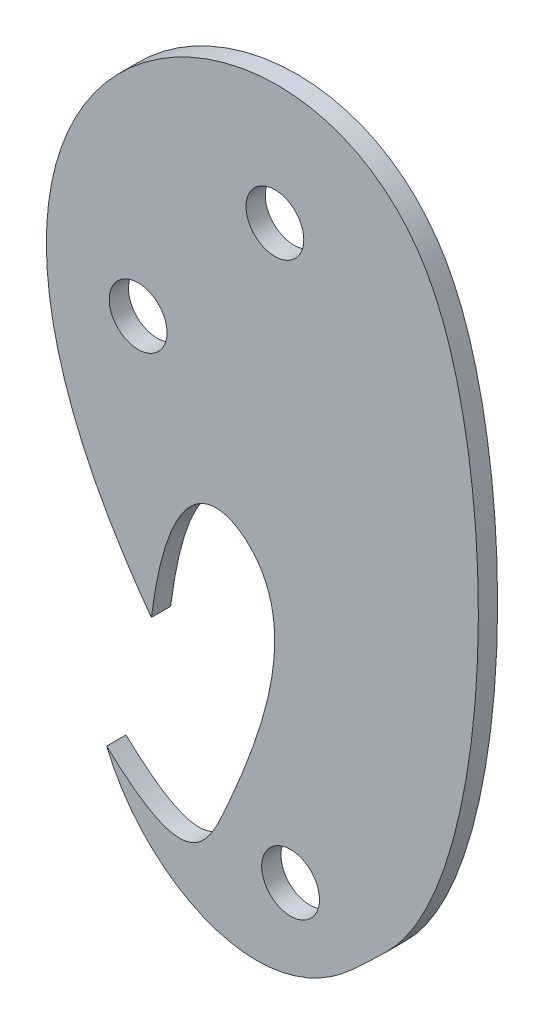
ISO-10303-21;
HEADER;
FILE_DESCRIPTION(('STEP AP214'),'2;1');
FILE_NAME('part.step','',(''),(''),'','','');
FILE_SCHEMA(('AUTOMOTIVE_DESIGN { 1 0 10303 214 1 1 1 1 }'));
ENDSEC;
DATA;
#1=APPLICATION_CONTEXT('core data for automotive mechanical design processes');
#2=APPLICATION_PROTOCOL_DEFINITION('international standard','automotive_design',2000,#1);
#3=PRODUCT_CONTEXT('',#1,'mechanical');
#4=PRODUCT('Part','Part','',(#3));
#5=PRODUCT_RELATED_PRODUCT_CATEGORY('part','',(#4));
#6=PRODUCT_DEFINITION_FORMATION('','',#4);
#7=PRODUCT_DEFINITION_CONTEXT('part definition',#1,'design');
#8=PRODUCT_DEFINITION('design','',#6,#7);
#9=PRODUCT_DEFINITION_SHAPE('','',#8);
#10=(LENGTH_UNIT() NAMED_UNIT(*) SI_UNIT(.MILLI.,.METRE.));
#11=(NAMED_UNIT(*) PLANE_ANGLE_UNIT() SI_UNIT($,.RADIAN.));
#12=(NAMED_UNIT(*) SI_UNIT($,.STERADIAN.) SOLID_ANGLE_UNIT());
#13=UNCERTAINTY_MEASURE_WITH_UNIT(LENGTH_MEASURE(1.E-05),#10,'distance_accuracy_value','');
#14=(GEOMETRIC_REPRESENTATION_CONTEXT(3) GLOBAL_UNCERTAINTY_ASSIGNED_CONTEXT((#13)) GLOBAL_UNIT_ASSIGNED_CONTEXT((#10,
#11,#12)) REPRESENTATION_CONTEXT('',''));
#15=CARTESIAN_POINT('',(0.,0.,0.));
#16=DIRECTION('',(0.,0.,1.));
#17=DIRECTION('',(1.,0.,0.));
#18=AXIS2_PLACEMENT_3D('',#15,#16,#17);
#19=CARTESIAN_POINT('',(23.88510901018,4.32851904847762,2.));
#20=DIRECTION('',(0.,0.,1.));
#21=DIRECTION('',(1.,0.,0.));
#22=AXIS2_PLACEMENT_3D('',#19,#20,#21);
#23=PLANE('',#22);
#24=CARTESIAN_POINT('',(9.99999999999999,29.8705540624877,2.));
#25=DIRECTION('',(0.,0.,1.));
#26=DIRECTION('',(1.,0.,0.));
#27=AXIS2_PLACEMENT_3D('',#24,#25,#26);
#28=CIRCLE('',#27,3.);
#29=CARTESIAN_POINT('',(13.,29.8705540624877,2.));
#30=VERTEX_POINT('',#29);
#31=EDGE_CURVE('E154',#30,#30,#28,.T.);
#32=ORIENTED_EDGE('',*,*,#31,.F.);
#33=EDGE_LOOP('',(#32));
#34=FACE_BOUND('',#33,.T.);
#35=CARTESIAN_POINT('',(11.3789737736667,3.46325798228975,2.));
#36=CARTESIAN_POINT('',(13.3658004233966,19.1008582665815,2.));
#37=CARTESIAN_POINT('',(28.926423979261,15.3502921598759,2.));
#38=CARTESIAN_POINT('',(21.0639719185286,-6.39581741201129,2.));
#39=CARTESIAN_POINT('',(15.1535158433434,-18.3534652344747,2.));
#40=CARTESIAN_POINT('',(6.74106393061712,-10.4206973958476,2.));
#41=B_SPLINE_CURVE_WITH_KNOTS('',3,(#35,#36,#37,#38,#39,#40),.UNSPECIFIED.,.F.,.F.,(4,1,1,4),
(0.,0.266777649852464,0.750922652130218,1.),.UNSPECIFIED.);
#42=CARTESIAN_POINT('',(11.3789737736667,3.46325798228975,2.));
#43=VERTEX_POINT('',#42);
#44=CARTESIAN_POINT('',(6.74106393061713,-10.4206973958476,2.));
#45=VERTEX_POINT('',#44);
#46=EDGE_CURVE('E84',#43,#45,#41,.T.);
#47=ORIENTED_EDGE('',*,*,#46,.T.);
#48=CARTESIAN_POINT('',(6.74106393061713,-10.4206973958476,2.));
#49=CARTESIAN_POINT('',(10.4459506741439,-19.7088932429149,2.));
#50=CARTESIAN_POINT('',(22.4443648123383,-26.7248449267395,2.));
#51=CARTESIAN_POINT('',(32.1940620499001,-17.8102030934079,2.));
#52=B_SPLINE_CURVE_WITH_KNOTS('',3,(#48,#49,#50,#51),.UNSPECIFIED.,.F.,.F.,(4,4),(0.,
0.946117244533495),.UNSPECIFIED.);
#53=CARTESIAN_POINT('',(32.1940620499001,-17.8102030934079,2.));
#54=VERTEX_POINT('',#53);
#55=EDGE_CURVE('E79',#45,#54,#52,.T.);
#56=ORIENTED_EDGE('',*,*,#55,.T.);
#57=CARTESIAN_POINT('',(-69.0252321897638,92.8905397840649,2.));
#58=DIRECTION('',(0.,0.,1.));
#59=DIRECTION('',(1.,0.,0.));
#60=AXIS2_PLACEMENT_3D('',#57,#58,#59);
#61=CIRCLE('',#60,150.);
#62=CARTESIAN_POINT('',(35.7875617430211,-14.4140650938413,2.));
#63=VERTEX_POINT('',#62);
#64=EDGE_CURVE('E82',#54,#63,#61,.T.);
#65=ORIENTED_EDGE('',*,*,#64,.T.);
#66=CARTESIAN_POINT('',(35.7875617430211,-14.4140650938413,2.));
#67=CARTESIAN_POINT('',(45.4685071407709,-4.95792911343836,2.));
#68=CARTESIAN_POINT('',(47.8347155170993,28.3571719224474,2.));
#69=CARTESIAN_POINT('',(31.0359835192934,75.2627719066818,2.));
#70=CARTESIAN_POINT('',(-20.4280796593643,46.5614143824123,2.));
#71=CARTESIAN_POINT('',(11.3789737736667,3.46325798228975,2.));
#72=B_SPLINE_CURVE_WITH_KNOTS('',3,(#66,#67,#68,#69,#70,#71),.UNSPECIFIED.,.F.,.F.,(4,1,1,4),
(0.,0.315050229455087,0.378467798660855,0.977567835259655),.UNSPECIFIED.);
#73=EDGE_CURVE('E49',#63,#43,#72,.T.);
#74=ORIENTED_EDGE('',*,*,#73,.T.);
#75=EDGE_LOOP('',(#47,#56,#65,#74));
#76=FACE_BOUND('',#75,.T.);
#77=CARTESIAN_POINT('',(24.2037012803556,45.3384197826969,2.));
#78=DIRECTION('',(0.,0.,1.));
#79=DIRECTION('',(1.,0.,0.));
#80=AXIS2_PLACEMENT_3D('',#77,#78,#79);
#81=CIRCLE('',#80,3.);
#82=CARTESIAN_POINT('',(27.2037012803556,45.3384197826969,2.));
#83=VERTEX_POINT('',#82);
#84=EDGE_CURVE('E160',#83,#83,#81,.T.);
#85=ORIENTED_EDGE('',*,*,#84,.F.);
#86=EDGE_LOOP('',(#85));
#87=FACE_BOUND('',#86,.T.);
#88=CARTESIAN_POINT('',(25.833353061438,-13.177172291622,2.));
#89=DIRECTION('',(0.,0.,1.));
#90=DIRECTION('',(1.,0.,0.));
#91=AXIS2_PLACEMENT_3D('',#88,#89,#90);
#92=CIRCLE('',#91,3.);
#93=CARTESIAN_POINT('',(28.833353061438,-13.177172291622,2.));
#94=VERTEX_POINT('',#93);
#95=EDGE_CURVE('E145',#94,#94,#92,.T.);
#96=ORIENTED_EDGE('',*,*,#95,.F.);
#97=EDGE_LOOP('',(#96));
#98=FACE_BOUND('',#97,.T.);
#99=ADVANCED_FACE('F31',(#34,#76,#87,#98),#23,.T.);
#100=CARTESIAN_POINT('',(23.88510901018,4.32851904847762,0.));
#101=DIRECTION('',(0.,0.,1.));
#102=DIRECTION('',(1.,0.,0.));
#103=AXIS2_PLACEMENT_3D('',#100,#101,#102);
#104=PLANE('',#103);
#105=CARTESIAN_POINT('',(9.99999999999999,29.8705540624877,0.));
#106=DIRECTION('',(0.,0.,1.));
#107=DIRECTION('',(1.,0.,0.));
#108=AXIS2_PLACEMENT_3D('',#105,#106,#107);
#109=CIRCLE('',#108,3.);
#110=CARTESIAN_POINT('',(13.,29.8705540624877,0.));
#111=VERTEX_POINT('',#110);
#112=EDGE_CURVE('E151',#111,#111,#109,.T.);
#113=ORIENTED_EDGE('',*,*,#112,.T.);
#114=EDGE_LOOP('',(#113));
#115=FACE_BOUND('',#114,.T.);
#116=CARTESIAN_POINT('',(11.3789737736667,3.46325798228975,0.));
#117=CARTESIAN_POINT('',(13.3658004233966,19.1008582665815,0.));
#118=CARTESIAN_POINT('',(28.926423979261,15.3502921598759,0.));
#119=CARTESIAN_POINT('',(21.0639719185286,-6.39581741201129,0.));
#120=CARTESIAN_POINT('',(15.1535158433434,-18.3534652344747,0.));
#121=CARTESIAN_POINT('',(6.74106393061712,-10.4206973958476,0.));
#122=B_SPLINE_CURVE_WITH_KNOTS('',3,(#116,#117,#118,#119,#120,#121),.UNSPECIFIED.,.F.,.F.,(4,1,
1,4),(0.,0.266777649852464,0.750922652130218,1.),.UNSPECIFIED.);
#123=CARTESIAN_POINT('',(11.3789737736667,3.46325798228975,0.));
#124=VERTEX_POINT('',#123);
#125=CARTESIAN_POINT('',(6.74106393061713,-10.4206973958476,0.));
#126=VERTEX_POINT('',#125);
#127=EDGE_CURVE('E101',#124,#126,#122,.T.);
#128=ORIENTED_EDGE('',*,*,#127,.F.);
#129=CARTESIAN_POINT('',(35.7875617430211,-14.4140650938413,0.));
#130=CARTESIAN_POINT('',(45.4685071407709,-4.95792911343836,0.));
#131=CARTESIAN_POINT('',(47.8347155170993,28.3571719224474,0.));
#132=CARTESIAN_POINT('',(31.0359835192934,75.2627719066818,0.));
#133=CARTESIAN_POINT('',(-20.4280796593643,46.5614143824123,0.));
#134=CARTESIAN_POINT('',(11.3789737736667,3.46325798228975,0.));
#135=B_SPLINE_CURVE_WITH_KNOTS('',3,(#129,#130,#131,#132,#133,#134),.UNSPECIFIED.,.F.,.F.,(4,1,
1,4),(0.,0.315050229455087,0.378467798660855,0.977567835259655),.UNSPECIFIED.);
#136=CARTESIAN_POINT('',(35.7875617430211,-14.4140650938413,0.));
#137=VERTEX_POINT('',#136);
#138=EDGE_CURVE('E72',#137,#124,#135,.T.);
#139=ORIENTED_EDGE('',*,*,#138,.F.);
#140=CARTESIAN_POINT('',(-69.0252321897638,92.8905397840649,0.));
#141=DIRECTION('',(0.,0.,1.));
#142=DIRECTION('',(1.,0.,0.));
#143=AXIS2_PLACEMENT_3D('',#140,#141,#142);
#144=CIRCLE('',#143,150.);
#145=CARTESIAN_POINT('',(32.1940620499001,-17.8102030934079,0.));
#146=VERTEX_POINT('',#145);
#147=EDGE_CURVE('E66',#146,#137,#144,.T.);
#148=ORIENTED_EDGE('',*,*,#147,.F.);
#149=CARTESIAN_POINT('',(6.74106393061713,-10.4206973958476,0.));
#150=CARTESIAN_POINT('',(10.4459506741439,-19.7088932429149,0.));
#151=CARTESIAN_POINT('',(22.4443648123383,-26.7248449267395,0.));
#152=CARTESIAN_POINT('',(32.1940620499001,-17.8102030934079,0.));
#153=B_SPLINE_CURVE_WITH_KNOTS('',3,(#149,#150,#151,#152),.UNSPECIFIED.,.F.,.F.,(4,4),(0.,
0.946117244533495),.UNSPECIFIED.);
#154=EDGE_CURVE('E88',#126,#146,#153,.T.);
#155=ORIENTED_EDGE('',*,*,#154,.F.);
#156=EDGE_LOOP('',(#128,#139,#148,#155));
#157=FACE_BOUND('',#156,.T.);
#158=CARTESIAN_POINT('',(24.2037012803556,45.3384197826969,0.));
#159=DIRECTION('',(0.,0.,1.));
#160=DIRECTION('',(1.,0.,0.));
#161=AXIS2_PLACEMENT_3D('',#158,#159,#160);
#162=CIRCLE('',#161,3.);
#163=CARTESIAN_POINT('',(27.2037012803556,45.3384197826969,0.));
#164=VERTEX_POINT('',#163);
#165=EDGE_CURVE('E157',#164,#164,#162,.T.);
#166=ORIENTED_EDGE('',*,*,#165,.T.);
#167=EDGE_LOOP('',(#166));
#168=FACE_BOUND('',#167,.T.);
#169=CARTESIAN_POINT('',(25.833353061438,-13.177172291622,0.));
#170=DIRECTION('',(0.,0.,1.));
#171=DIRECTION('',(1.,0.,0.));
#172=AXIS2_PLACEMENT_3D('',#169,#170,#171);
#173=CIRCLE('',#172,3.);
#174=CARTESIAN_POINT('',(28.833353061438,-13.177172291622,0.));
#175=VERTEX_POINT('',#174);
#176=EDGE_CURVE('E148',#175,#175,#173,.T.);
#177=ORIENTED_EDGE('',*,*,#176,.T.);
#178=EDGE_LOOP('',(#177));
#179=FACE_BOUND('',#178,.T.);
#180=ADVANCED_FACE('F114',(#115,#157,#168,#179),#104,.F.);
#181=DIRECTION('',(0.,0.,-1.));
#182=VECTOR('',#181,1.);
#183=SURFACE_OF_LINEAR_EXTRUSION('',#41,#182);
#184=ORIENTED_EDGE('',*,*,#127,.T.);
#185=DIRECTION('',(0.,0.,-1.));
#186=VECTOR('',#185,1.);
#187=CARTESIAN_POINT('',(6.74106393061713,-10.4206973958476,2.));
#188=LINE('',#187,#186);
#189=EDGE_CURVE('E11',#45,#126,#188,.T.);
#190=ORIENTED_EDGE('',*,*,#189,.F.);
#191=ORIENTED_EDGE('',*,*,#46,.F.);
#192=DIRECTION('',(0.,0.,-1.));
#193=VECTOR('',#192,1.);
#194=CARTESIAN_POINT('',(11.3789737736667,3.46325798228975,2.));
#195=LINE('',#194,#193);
#196=EDGE_CURVE('E92',#43,#124,#195,.T.);
#197=ORIENTED_EDGE('',*,*,#196,.T.);
#198=EDGE_LOOP('',(#184,#190,#191,#197));
#199=FACE_BOUND('',#198,.T.);
#200=ADVANCED_FACE('F33',(#199),#183,.F.);
#201=DIRECTION('',(0.,0.,-1.));
#202=VECTOR('',#201,1.);
#203=SURFACE_OF_LINEAR_EXTRUSION('',#52,#202);
#204=ORIENTED_EDGE('',*,*,#154,.T.);
#205=DIRECTION('',(0.,0.,-1.));
#206=VECTOR('',#205,1.);
#207=CARTESIAN_POINT('',(32.1940620499001,-17.8102030934079,2.));
#208=LINE('',#207,#206);
#209=EDGE_CURVE('E41',#54,#146,#208,.T.);
#210=ORIENTED_EDGE('',*,*,#209,.F.);
#211=ORIENTED_EDGE('',*,*,#55,.F.);
#212=ORIENTED_EDGE('',*,*,#189,.T.);
#213=EDGE_LOOP('',(#204,#210,#211,#212));
#214=FACE_BOUND('',#213,.T.);
#215=ADVANCED_FACE('F87',(#214),#203,.F.);
#216=CARTESIAN_POINT('',(-69.0252321897638,92.8905397840649,2.));
#217=DIRECTION('',(0.,0.,-1.));
#218=DIRECTION('',(-1.,0.,0.));
#219=AXIS2_PLACEMENT_3D('',#216,#217,#218);
#220=CYLINDRICAL_SURFACE('',#219,150.);
#221=ORIENTED_EDGE('',*,*,#147,.T.);
#222=DIRECTION('',(0.,0.,-1.));
#223=VECTOR('',#222,1.);
#224=CARTESIAN_POINT('',(35.7875617430211,-14.4140650938413,2.));
#225=LINE('',#224,#223);
#226=EDGE_CURVE('E89',#63,#137,#225,.T.);
#227=ORIENTED_EDGE('',*,*,#226,.F.);
#228=ORIENTED_EDGE('',*,*,#64,.F.);
#229=ORIENTED_EDGE('',*,*,#209,.T.);
#230=EDGE_LOOP('',(#221,#227,#228,#229));
#231=FACE_BOUND('',#230,.T.);
#232=ADVANCED_FACE('F90',(#231),#220,.T.);
#233=DIRECTION('',(0.,0.,-1.));
#234=VECTOR('',#233,1.);
#235=SURFACE_OF_LINEAR_EXTRUSION('',#72,#234);
#236=ORIENTED_EDGE('',*,*,#138,.T.);
#237=ORIENTED_EDGE('',*,*,#196,.F.);
#238=ORIENTED_EDGE('',*,*,#73,.F.);
#239=ORIENTED_EDGE('',*,*,#226,.T.);
#240=EDGE_LOOP('',(#236,#237,#238,#239));
#241=FACE_BOUND('',#240,.T.);
#242=ADVANCED_FACE('F109',(#241),#235,.F.);
#243=CARTESIAN_POINT('',(24.2037012803556,45.3384197826969,2.));
#244=DIRECTION('',(0.,0.,-1.));
#245=DIRECTION('',(-1.,0.,0.));
#246=AXIS2_PLACEMENT_3D('',#243,#244,#245);
#247=CYLINDRICAL_SURFACE('',#246,3.);
#248=ORIENTED_EDGE('',*,*,#84,.T.);
#249=EDGE_LOOP('',(#248));
#250=FACE_BOUND('',#249,.T.);
#251=ORIENTED_EDGE('',*,*,#165,.F.);
#252=EDGE_LOOP('',(#251));
#253=FACE_BOUND('',#252,.T.);
#254=ADVANCED_FACE('F113',(#250,#253),#247,.F.);
#255=CARTESIAN_POINT('',(9.99999999999999,29.8705540624877,2.));
#256=DIRECTION('',(0.,0.,-1.));
#257=DIRECTION('',(-1.,0.,0.));
#258=AXIS2_PLACEMENT_3D('',#255,#256,#257);
#259=CYLINDRICAL_SURFACE('',#258,3.);
#260=ORIENTED_EDGE('',*,*,#31,.T.);
#261=EDGE_LOOP('',(#260));
#262=FACE_BOUND('',#261,.T.);
#263=ORIENTED_EDGE('',*,*,#112,.F.);
#264=EDGE_LOOP('',(#263));
#265=FACE_BOUND('',#264,.T.);
#266=ADVANCED_FACE('F132',(#262,#265),#259,.F.);
#267=CARTESIAN_POINT('',(25.833353061438,-13.177172291622,2.));
#268=DIRECTION('',(0.,0.,-1.));
#269=DIRECTION('',(-1.,0.,0.));
#270=AXIS2_PLACEMENT_3D('',#267,#268,#269);
#271=CYLINDRICAL_SURFACE('',#270,3.);
#272=ORIENTED_EDGE('',*,*,#95,.T.);
#273=EDGE_LOOP('',(#272));
#274=FACE_BOUND('',#273,.T.);
#275=ORIENTED_EDGE('',*,*,#176,.F.);
#276=EDGE_LOOP('',(#275));
#277=FACE_BOUND('',#276,.T.);
#278=ADVANCED_FACE('F136',(#274,#277),#271,.F.);
#279=CLOSED_SHELL('',(#99,#180,#200,#215,#232,#242,#254,#266,#278));
#280=MANIFOLD_SOLID_BREP('B2',#279);
#281=ADVANCED_BREP_SHAPE_REPRESENTATION('',(#18,#280),#14);
#282=SHAPE_DEFINITION_REPRESENTATION(#9,#281);
ENDSEC;
END-ISO-10303-21;
